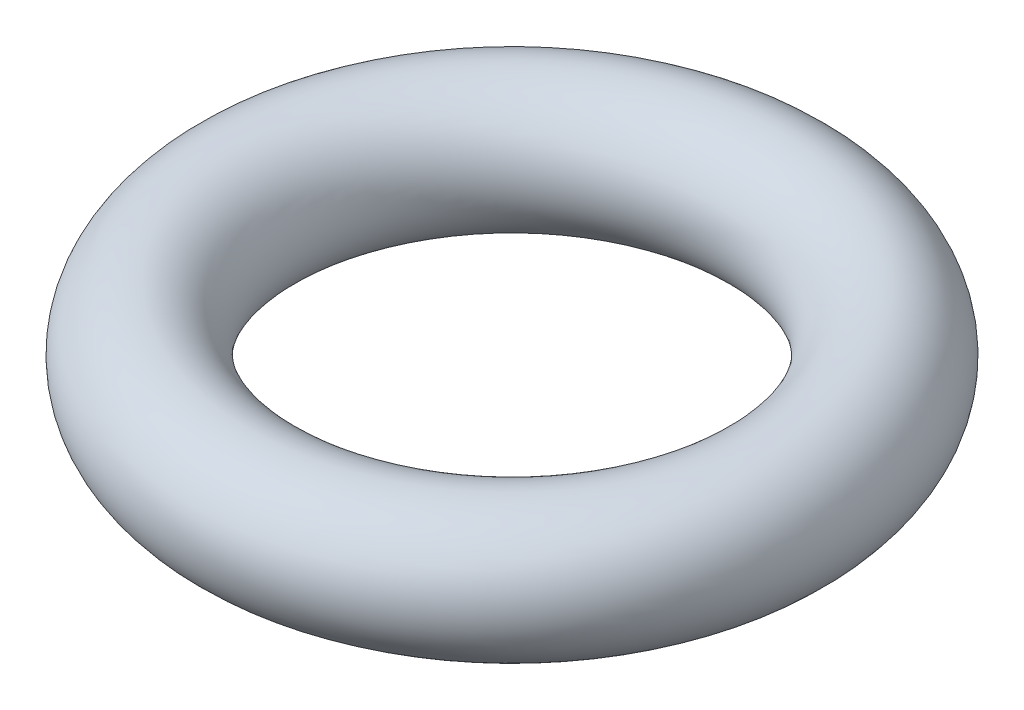
ISO-10303-21;
HEADER;
FILE_DESCRIPTION(('STEP AP214'),'2;1');
FILE_NAME('part.step','',(''),(''),'','','');
FILE_SCHEMA(('AUTOMOTIVE_DESIGN { 1 0 10303 214 1 1 1 1 }'));
ENDSEC;
DATA;
#1=APPLICATION_CONTEXT('core data for automotive mechanical design processes');
#2=APPLICATION_PROTOCOL_DEFINITION('international standard','automotive_design',2000,#1);
#3=PRODUCT_CONTEXT('',#1,'mechanical');
#4=PRODUCT('Part','Part','',(#3));
#5=PRODUCT_RELATED_PRODUCT_CATEGORY('part','',(#4));
#6=PRODUCT_DEFINITION_FORMATION('','',#4);
#7=PRODUCT_DEFINITION_CONTEXT('part definition',#1,'design');
#8=PRODUCT_DEFINITION('design','',#6,#7);
#9=PRODUCT_DEFINITION_SHAPE('','',#8);
#10=(LENGTH_UNIT() NAMED_UNIT(*) SI_UNIT(.MILLI.,.METRE.));
#11=(NAMED_UNIT(*) PLANE_ANGLE_UNIT() SI_UNIT($,.RADIAN.));
#12=(NAMED_UNIT(*) SI_UNIT($,.STERADIAN.) SOLID_ANGLE_UNIT());
#13=UNCERTAINTY_MEASURE_WITH_UNIT(LENGTH_MEASURE(1.E-05),#10,'distance_accuracy_value','');
#14=(GEOMETRIC_REPRESENTATION_CONTEXT(3) GLOBAL_UNCERTAINTY_ASSIGNED_CONTEXT((#13)) GLOBAL_UNIT_ASSIGNED_CONTEXT((#10,
#11,#12)) REPRESENTATION_CONTEXT('',''));
#15=CARTESIAN_POINT('',(0.,0.,0.));
#16=DIRECTION('',(0.,0.,1.));
#17=DIRECTION('',(1.,0.,0.));
#18=AXIS2_PLACEMENT_3D('',#15,#16,#17);
#19=CARTESIAN_POINT('',(0.,0.,0.));
#20=DIRECTION('',(0.,-1.,0.));
#21=DIRECTION('',(0.,0.,-1.));
#22=AXIS2_PLACEMENT_3D('',#19,#20,#21);
#23=TOROIDAL_SURFACE('',#22,20.,5.);
#24=CARTESIAN_POINT('',(0.,0.,-25.));
#25=VERTEX_POINT('',#24);
#26=VERTEX_LOOP('',#25);
#27=FACE_BOUND('',#26,.T.);
#28=ADVANCED_FACE('F38',(#27),#23,.T.);
#29=CLOSED_SHELL('',(#28));
#30=MANIFOLD_SOLID_BREP('B2',#29);
#31=ADVANCED_BREP_SHAPE_REPRESENTATION('',(#18,#30),#14);
#32=SHAPE_DEFINITION_REPRESENTATION(#9,#31);
ENDSEC;
END-ISO-10303-21;
